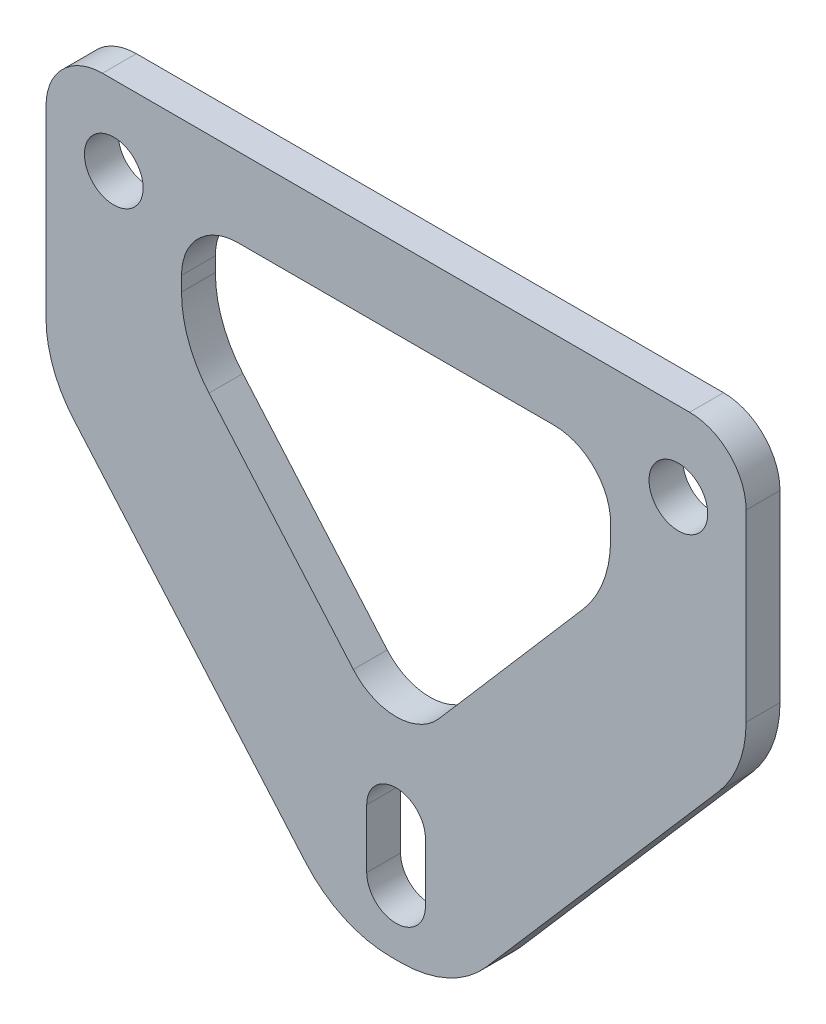
ISO-10303-21;
HEADER;
FILE_DESCRIPTION(('STEP AP214'),'2;1');
FILE_NAME('part.step','',(''),(''),'','','');
FILE_SCHEMA(('AUTOMOTIVE_DESIGN { 1 0 10303 214 1 1 1 1 }'));
ENDSEC;
DATA;
#1=APPLICATION_CONTEXT('core data for automotive mechanical design processes');
#2=APPLICATION_PROTOCOL_DEFINITION('international standard','automotive_design',2000,#1);
#3=PRODUCT_CONTEXT('',#1,'mechanical');
#4=PRODUCT('Part','Part','',(#3));
#5=PRODUCT_RELATED_PRODUCT_CATEGORY('part','',(#4));
#6=PRODUCT_DEFINITION_FORMATION('','',#4);
#7=PRODUCT_DEFINITION_CONTEXT('part definition',#1,'design');
#8=PRODUCT_DEFINITION('design','',#6,#7);
#9=PRODUCT_DEFINITION_SHAPE('','',#8);
#10=(LENGTH_UNIT() NAMED_UNIT(*) SI_UNIT(.MILLI.,.METRE.));
#11=(NAMED_UNIT(*) PLANE_ANGLE_UNIT() SI_UNIT($,.RADIAN.));
#12=(NAMED_UNIT(*) SI_UNIT($,.STERADIAN.) SOLID_ANGLE_UNIT());
#13=UNCERTAINTY_MEASURE_WITH_UNIT(LENGTH_MEASURE(1.E-05),#10,'distance_accuracy_value','');
#14=(GEOMETRIC_REPRESENTATION_CONTEXT(3) GLOBAL_UNCERTAINTY_ASSIGNED_CONTEXT((#13)) GLOBAL_UNIT_ASSIGNED_CONTEXT((#10,
#11,#12)) REPRESENTATION_CONTEXT('',''));
#15=CARTESIAN_POINT('',(0.,0.,0.));
#16=DIRECTION('',(0.,0.,1.));
#17=DIRECTION('',(1.,0.,0.));
#18=AXIS2_PLACEMENT_3D('',#15,#16,#17);
#19=CARTESIAN_POINT('',(-31.,-25.5594059405941,-3.));
#20=DIRECTION('',(-1.,0.,0.));
#21=DIRECTION('',(0.,-1.,0.));
#22=AXIS2_PLACEMENT_3D('',#19,#20,#21);
#23=PLANE('',#22);
#24=DIRECTION('',(0.,-1.,0.));
#25=VECTOR('',#24,1.);
#26=CARTESIAN_POINT('',(-31.,-25.5594059405941,0.));
#27=LINE('',#26,#25);
#28=CARTESIAN_POINT('',(-31.,-5.55940594059406,0.));
#29=VERTEX_POINT('',#28);
#30=CARTESIAN_POINT('',(-31.,-21.8290726780716,0.));
#31=VERTEX_POINT('',#30);
#32=EDGE_CURVE('E289',#29,#31,#27,.T.);
#33=ORIENTED_EDGE('',*,*,#32,.F.);
#34=DIRECTION('',(0.,0.,1.));
#35=VECTOR('',#34,1.);
#36=CARTESIAN_POINT('',(-31.,-5.55940594059406,-3.));
#37=LINE('',#36,#35);
#38=CARTESIAN_POINT('',(-31.,-5.55940594059406,-3.));
#39=VERTEX_POINT('',#38);
#40=EDGE_CURVE('E58',#29,#39,#37,.F.);
#41=ORIENTED_EDGE('',*,*,#40,.T.);
#42=DIRECTION('',(0.,-1.,0.));
#43=VECTOR('',#42,1.);
#44=CARTESIAN_POINT('',(-31.,-25.5594059405941,-3.));
#45=LINE('',#44,#43);
#46=CARTESIAN_POINT('',(-31.,-21.8290726780716,-3.));
#47=VERTEX_POINT('',#46);
#48=EDGE_CURVE('E293',#39,#47,#45,.T.);
#49=ORIENTED_EDGE('',*,*,#48,.T.);
#50=DIRECTION('',(0.,0.,1.));
#51=VECTOR('',#50,1.);
#52=CARTESIAN_POINT('',(-31.,-21.8290726780716,-3.));
#53=LINE('',#52,#51);
#54=EDGE_CURVE('E395',#47,#31,#53,.T.);
#55=ORIENTED_EDGE('',*,*,#54,.T.);
#56=EDGE_LOOP('',(#33,#41,#49,#55));
#57=FACE_BOUND('',#56,.T.);
#58=ADVANCED_FACE('F42',(#57),#23,.T.);
#59=CARTESIAN_POINT('',(-31.,-0.55940594059406,-3.));
#60=DIRECTION('',(0.,1.,0.));
#61=DIRECTION('',(-1.,0.,0.));
#62=AXIS2_PLACEMENT_3D('',#59,#60,#61);
#63=PLANE('',#62);
#64=DIRECTION('',(-1.,0.,0.));
#65=VECTOR('',#64,1.);
#66=CARTESIAN_POINT('',(-31.,-0.55940594059406,0.));
#67=LINE('',#66,#65);
#68=CARTESIAN_POINT('',(26.,-0.559405940594053,0.));
#69=VERTEX_POINT('',#68);
#70=CARTESIAN_POINT('',(-26.,-0.559405940594059,0.));
#71=VERTEX_POINT('',#70);
#72=EDGE_CURVE('E297',#69,#71,#67,.T.);
#73=ORIENTED_EDGE('',*,*,#72,.F.);
#74=DIRECTION('',(0.,0.,1.));
#75=VECTOR('',#74,1.);
#76=CARTESIAN_POINT('',(26.,-0.559405940594053,-3.));
#77=LINE('',#76,#75);
#78=CARTESIAN_POINT('',(26.,-0.559405940594053,-3.));
#79=VERTEX_POINT('',#78);
#80=EDGE_CURVE('E445',#69,#79,#77,.F.);
#81=ORIENTED_EDGE('',*,*,#80,.T.);
#82=DIRECTION('',(-1.,0.,0.));
#83=VECTOR('',#82,1.);
#84=CARTESIAN_POINT('',(-31.,-0.55940594059406,-3.));
#85=LINE('',#84,#83);
#86=CARTESIAN_POINT('',(-26.,-0.559405940594059,-3.));
#87=VERTEX_POINT('',#86);
#88=EDGE_CURVE('E313',#79,#87,#85,.T.);
#89=ORIENTED_EDGE('',*,*,#88,.T.);
#90=DIRECTION('',(0.,0.,1.));
#91=VECTOR('',#90,1.);
#92=CARTESIAN_POINT('',(-26.,-0.559405940594059,-3.));
#93=LINE('',#92,#91);
#94=EDGE_CURVE('E441',#87,#71,#93,.T.);
#95=ORIENTED_EDGE('',*,*,#94,.T.);
#96=EDGE_LOOP('',(#73,#81,#89,#95));
#97=FACE_BOUND('',#96,.T.);
#98=ADVANCED_FACE('F561',(#97),#63,.T.);
#99=CARTESIAN_POINT('',(31.,-0.559405940594052,-3.));
#100=DIRECTION('',(1.,0.,0.));
#101=DIRECTION('',(0.,1.,0.));
#102=AXIS2_PLACEMENT_3D('',#99,#100,#101);
#103=PLANE('',#102);
#104=DIRECTION('',(0.,1.,0.));
#105=VECTOR('',#104,1.);
#106=CARTESIAN_POINT('',(31.,-0.559405940594052,-3.));
#107=LINE('',#106,#105);
#108=CARTESIAN_POINT('',(31.,-21.8290726780716,-3.));
#109=VERTEX_POINT('',#108);
#110=CARTESIAN_POINT('',(31.,-5.55940594059405,-3.));
#111=VERTEX_POINT('',#110);
#112=EDGE_CURVE('E309',#109,#111,#107,.T.);
#113=ORIENTED_EDGE('',*,*,#112,.T.);
#114=DIRECTION('',(0.,0.,1.));
#115=VECTOR('',#114,1.);
#116=CARTESIAN_POINT('',(31.,-5.55940594059405,-3.));
#117=LINE('',#116,#115);
#118=CARTESIAN_POINT('',(31.,-5.55940594059405,0.));
#119=VERTEX_POINT('',#118);
#120=EDGE_CURVE('E431',#111,#119,#117,.T.);
#121=ORIENTED_EDGE('',*,*,#120,.T.);
#122=DIRECTION('',(0.,1.,0.));
#123=VECTOR('',#122,1.);
#124=CARTESIAN_POINT('',(31.,-0.559405940594052,0.));
#125=LINE('',#124,#123);
#126=CARTESIAN_POINT('',(31.,-21.8290726780716,0.));
#127=VERTEX_POINT('',#126);
#128=EDGE_CURVE('E332',#127,#119,#125,.T.);
#129=ORIENTED_EDGE('',*,*,#128,.F.);
#130=DIRECTION('',(0.,0.,1.));
#131=VECTOR('',#130,1.);
#132=CARTESIAN_POINT('',(31.,-21.8290726780716,-3.));
#133=LINE('',#132,#131);
#134=EDGE_CURVE('E365',#127,#109,#133,.F.);
#135=ORIENTED_EDGE('',*,*,#134,.T.);
#136=EDGE_LOOP('',(#113,#121,#129,#135));
#137=FACE_BOUND('',#136,.T.);
#138=ADVANCED_FACE('F566',(#137),#103,.T.);
#139=CARTESIAN_POINT('',(31.,-25.5594059405941,-3.));
#140=DIRECTION('',(0.755689082789818,-0.654930538417842,0.));
#141=DIRECTION('',(0.654930538417842,0.755689082789818,0.));
#142=AXIS2_PLACEMENT_3D('',#139,#140,#141);
#143=PLANE('',#142);
#144=DIRECTION('',(0.654930538417842,0.755689082789818,0.));
#145=VECTOR('',#144,1.);
#146=CARTESIAN_POINT('',(31.,-25.5594059405941,-3.));
#147=LINE('',#146,#145);
#148=CARTESIAN_POINT('',(7.99060200037871,-52.1087113247725,-3.));
#149=VERTEX_POINT('',#148);
#150=CARTESIAN_POINT('',(28.5568908278982,-28.37837806225,-3.));
#151=VERTEX_POINT('',#150);
#152=EDGE_CURVE('E305',#149,#151,#147,.T.);
#153=ORIENTED_EDGE('',*,*,#152,.T.);
#154=DIRECTION('',(0.,0.,1.));
#155=VECTOR('',#154,1.);
#156=CARTESIAN_POINT('',(28.5568908278982,-28.37837806225,-3.));
#157=LINE('',#156,#155);
#158=CARTESIAN_POINT('',(28.5568908278982,-28.37837806225,0.));
#159=VERTEX_POINT('',#158);
#160=EDGE_CURVE('E349',#151,#159,#157,.T.);
#161=ORIENTED_EDGE('',*,*,#160,.T.);
#162=DIRECTION('',(0.654930538417842,0.755689082789818,0.));
#163=VECTOR('',#162,1.);
#164=CARTESIAN_POINT('',(31.,-25.5594059405941,0.));
#165=LINE('',#164,#163);
#166=CARTESIAN_POINT('',(7.99060200037871,-52.1087113247725,0.));
#167=VERTEX_POINT('',#166);
#168=EDGE_CURVE('E328',#167,#159,#165,.T.);
#169=ORIENTED_EDGE('',*,*,#168,.F.);
#170=DIRECTION('',(0.,0.,1.));
#171=VECTOR('',#170,1.);
#172=CARTESIAN_POINT('',(7.99060200037872,-52.1087113247725,-3.));
#173=LINE('',#172,#171);
#174=EDGE_CURVE('E346',#167,#149,#173,.F.);
#175=ORIENTED_EDGE('',*,*,#174,.T.);
#176=EDGE_LOOP('',(#153,#161,#169,#175));
#177=FACE_BOUND('',#176,.T.);
#178=ADVANCED_FACE('F625',(#177),#143,.T.);
#179=CARTESIAN_POINT('',(5.00000000000001,-55.5594059405941,-3.));
#180=DIRECTION('',(0.,-1.,0.));
#181=DIRECTION('',(0.,0.,-1.));
#182=AXIS2_PLACEMENT_3D('',#179,#180,#181);
#183=PLANE('',#182);
#184=DIRECTION('',(1.,0.,0.));
#185=VECTOR('',#184,1.);
#186=CARTESIAN_POINT('',(5.00000000000001,-55.5594059405941,-3.));
#187=LINE('',#186,#185);
#188=CARTESIAN_POINT('',(-0.433711172480529,-55.5594059405941,-3.));
#189=VERTEX_POINT('',#188);
#190=CARTESIAN_POINT('',(0.433711172480544,-55.5594059405941,-3.));
#191=VERTEX_POINT('',#190);
#192=EDGE_CURVE('E301',#189,#191,#187,.T.);
#193=ORIENTED_EDGE('',*,*,#192,.T.);
#194=DIRECTION('',(0.,0.,1.));
#195=VECTOR('',#194,1.);
#196=CARTESIAN_POINT('',(0.433711172480544,-55.5594059405941,-3.));
#197=LINE('',#196,#195);
#198=CARTESIAN_POINT('',(0.433711172480544,-55.5594059405941,0.));
#199=VERTEX_POINT('',#198);
#200=EDGE_CURVE('E384',#191,#199,#197,.T.);
#201=ORIENTED_EDGE('',*,*,#200,.T.);
#202=DIRECTION('',(1.,0.,0.));
#203=VECTOR('',#202,1.);
#204=CARTESIAN_POINT('',(5.00000000000001,-55.5594059405941,0.));
#205=LINE('',#204,#203);
#206=CARTESIAN_POINT('',(-0.433711172480529,-55.5594059405941,0.));
#207=VERTEX_POINT('',#206);
#208=EDGE_CURVE('E324',#207,#199,#205,.T.);
#209=ORIENTED_EDGE('',*,*,#208,.F.);
#210=DIRECTION('',(0.,0.,1.));
#211=VECTOR('',#210,1.);
#212=CARTESIAN_POINT('',(-0.433711172480529,-55.5594059405941,-3.));
#213=LINE('',#212,#211);
#214=EDGE_CURVE('E381',#207,#189,#213,.F.);
#215=ORIENTED_EDGE('',*,*,#214,.T.);
#216=EDGE_LOOP('',(#193,#201,#209,#215));
#217=FACE_BOUND('',#216,.T.);
#218=ADVANCED_FACE('F632',(#217),#183,.T.);
#219=CARTESIAN_POINT('',(-4.99999999999999,-55.5594059405941,-3.));
#220=DIRECTION('',(-0.755689082789817,-0.654930538417842,0.));
#221=DIRECTION('',(0.654930538417842,-0.755689082789818,0.));
#222=AXIS2_PLACEMENT_3D('',#219,#220,#221);
#223=PLANE('',#222);
#224=DIRECTION('',(0.654930538417842,-0.755689082789818,0.));
#225=VECTOR('',#224,1.);
#226=CARTESIAN_POINT('',(-4.99999999999999,-55.5594059405941,-3.));
#227=LINE('',#226,#225);
#228=CARTESIAN_POINT('',(-28.5568908278982,-28.37837806225,-3.));
#229=VERTEX_POINT('',#228);
#230=CARTESIAN_POINT('',(-7.9906020003787,-52.1087113247725,-3.));
#231=VERTEX_POINT('',#230);
#232=EDGE_CURVE('E296',#229,#231,#227,.T.);
#233=ORIENTED_EDGE('',*,*,#232,.T.);
#234=DIRECTION('',(0.,0.,1.));
#235=VECTOR('',#234,1.);
#236=CARTESIAN_POINT('',(-7.9906020003787,-52.1087113247725,-3.));
#237=LINE('',#236,#235);
#238=CARTESIAN_POINT('',(-7.9906020003787,-52.1087113247725,0.));
#239=VERTEX_POINT('',#238);
#240=EDGE_CURVE('E391',#231,#239,#237,.T.);
#241=ORIENTED_EDGE('',*,*,#240,.T.);
#242=DIRECTION('',(0.654930538417842,-0.755689082789818,0.));
#243=VECTOR('',#242,1.);
#244=CARTESIAN_POINT('',(-4.99999999999999,-55.5594059405941,0.));
#245=LINE('',#244,#243);
#246=CARTESIAN_POINT('',(-28.5568908278982,-28.37837806225,0.));
#247=VERTEX_POINT('',#246);
#248=EDGE_CURVE('E320',#247,#239,#245,.T.);
#249=ORIENTED_EDGE('',*,*,#248,.F.);
#250=DIRECTION('',(0.,0.,1.));
#251=VECTOR('',#250,1.);
#252=CARTESIAN_POINT('',(-28.5568908278982,-28.37837806225,-3.));
#253=LINE('',#252,#251);
#254=EDGE_CURVE('E388',#247,#229,#253,.F.);
#255=ORIENTED_EDGE('',*,*,#254,.T.);
#256=EDGE_LOOP('',(#233,#241,#249,#255));
#257=FACE_BOUND('',#256,.T.);
#258=ADVANCED_FACE('F571',(#257),#223,.T.);
#259=CARTESIAN_POINT('',(0.,0.,-3.));
#260=DIRECTION('',(0.,0.,-1.));
#261=DIRECTION('',(-1.,0.,0.));
#262=AXIS2_PLACEMENT_3D('',#259,#260,#261);
#263=PLANE('',#262);
#264=DIRECTION('',(-1.,0.,0.));
#265=VECTOR('',#264,1.);
#266=CARTESIAN_POINT('',(19.,-7.55940594059405,-3.));
#267=LINE('',#266,#265);
#268=CARTESIAN_POINT('',(14.,-7.55940594059405,-3.));
#269=VERTEX_POINT('',#268);
#270=CARTESIAN_POINT('',(-14.,-7.55940594059406,-3.));
#271=VERTEX_POINT('',#270);
#272=EDGE_CURVE('E507',#269,#271,#267,.T.);
#273=ORIENTED_EDGE('',*,*,#272,.T.);
#274=CARTESIAN_POINT('',(-14.,-12.5594059405941,-3.));
#275=DIRECTION('',(0.,0.,-1.));
#276=DIRECTION('',(-1.,0.,0.));
#277=AXIS2_PLACEMENT_3D('',#274,#275,#276);
#278=CIRCLE('',#277,5.);
#279=CARTESIAN_POINT('',(-19.,-12.5594059405941,-3.));
#280=VERTEX_POINT('',#279);
#281=EDGE_CURVE('E476',#271,#280,#278,.F.);
#282=ORIENTED_EDGE('',*,*,#281,.T.);
#283=DIRECTION('',(0.,-1.,0.));
#284=VECTOR('',#283,1.);
#285=CARTESIAN_POINT('',(-19.,-7.55940594059406,-3.));
#286=LINE('',#285,#284);
#287=CARTESIAN_POINT('',(-19.,-13.838940831385,-3.));
#288=VERTEX_POINT('',#287);
#289=EDGE_CURVE('E262',#280,#288,#286,.T.);
#290=ORIENTED_EDGE('',*,*,#289,.T.);
#291=CARTESIAN_POINT('',(-9.,-13.838940831385,-3.));
#292=DIRECTION('',(0.,0.,-1.));
#293=DIRECTION('',(-1.,0.,0.));
#294=AXIS2_PLACEMENT_3D('',#291,#292,#293);
#295=CIRCLE('',#294,10.);
#296=CARTESIAN_POINT('',(-16.5682300776916,-20.3751395348459,-3.));
#297=VERTEX_POINT('',#296);
#298=EDGE_CURVE('E418',#288,#297,#295,.F.);
#299=ORIENTED_EDGE('',*,*,#298,.T.);
#300=DIRECTION('',(0.653619870346093,-0.75682300776916,0.));
#301=VECTOR('',#300,1.);
#302=CARTESIAN_POINT('',(-19.,-17.5594059405941,-3.));
#303=LINE('',#302,#301);
#304=CARTESIAN_POINT('',(-3.78411503884579,-35.1777990535094,-3.));
#305=VERTEX_POINT('',#304);
#306=EDGE_CURVE('E503',#297,#305,#303,.T.);
#307=ORIENTED_EDGE('',*,*,#306,.T.);
#308=CARTESIAN_POINT('',(0.,-31.909699701779,-3.));
#309=DIRECTION('',(0.,0.,-1.));
#310=DIRECTION('',(-1.,0.,0.));
#311=AXIS2_PLACEMENT_3D('',#308,#309,#310);
#312=CIRCLE('',#311,5.);
#313=CARTESIAN_POINT('',(3.78411503884581,-35.1777990535094,-3.));
#314=VERTEX_POINT('',#313);
#315=EDGE_CURVE('E11',#305,#314,#312,.F.);
#316=ORIENTED_EDGE('',*,*,#315,.T.);
#317=DIRECTION('',(0.653619870346092,0.75682300776916,0.));
#318=VECTOR('',#317,1.);
#319=CARTESIAN_POINT('',(0.,-39.5594059405941,-3.));
#320=LINE('',#319,#318);
#321=CARTESIAN_POINT('',(16.5682300776916,-20.3751395348459,-3.));
#322=VERTEX_POINT('',#321);
#323=EDGE_CURVE('E498',#314,#322,#320,.T.);
#324=ORIENTED_EDGE('',*,*,#323,.T.);
#325=CARTESIAN_POINT('',(9.,-13.838940831385,-3.));
#326=DIRECTION('',(0.,0.,-1.));
#327=DIRECTION('',(-1.,0.,0.));
#328=AXIS2_PLACEMENT_3D('',#325,#326,#327);
#329=CIRCLE('',#328,10.);
#330=CARTESIAN_POINT('',(19.,-13.838940831385,-3.));
#331=VERTEX_POINT('',#330);
#332=EDGE_CURVE('E411',#322,#331,#329,.F.);
#333=ORIENTED_EDGE('',*,*,#332,.T.);
#334=DIRECTION('',(0.,1.,0.));
#335=VECTOR('',#334,1.);
#336=CARTESIAN_POINT('',(19.,-17.5594059405941,-3.));
#337=LINE('',#336,#335);
#338=CARTESIAN_POINT('',(19.,-12.5594059405941,-3.));
#339=VERTEX_POINT('',#338);
#340=EDGE_CURVE('E502',#331,#339,#337,.T.);
#341=ORIENTED_EDGE('',*,*,#340,.T.);
#342=CARTESIAN_POINT('',(14.,-12.5594059405941,-3.));
#343=DIRECTION('',(0.,0.,-1.));
#344=DIRECTION('',(-1.,0.,0.));
#345=AXIS2_PLACEMENT_3D('',#342,#343,#344);
#346=CIRCLE('',#345,5.);
#347=EDGE_CURVE('E470',#339,#269,#346,.F.);
#348=ORIENTED_EDGE('',*,*,#347,.T.);
#349=EDGE_LOOP('',(#273,#282,#290,#299,#307,#316,#324,#333,#341,#348));
#350=FACE_BOUND('',#349,.T.);
#351=CARTESIAN_POINT('',(0.,-50.1594059405941,-3.));
#352=DIRECTION('',(0.,0.,1.));
#353=DIRECTION('',(1.,0.,0.));
#354=AXIS2_PLACEMENT_3D('',#351,#352,#353);
#355=CIRCLE('',#354,2.6);
#356=CARTESIAN_POINT('',(-2.59999999999999,-50.1594059405941,-3.));
#357=VERTEX_POINT('',#356);
#358=CARTESIAN_POINT('',(2.60000000000001,-50.1594059405941,-3.));
#359=VERTEX_POINT('',#358);
#360=EDGE_CURVE('E220',#357,#359,#355,.T.);
#361=ORIENTED_EDGE('',*,*,#360,.T.);
#362=DIRECTION('',(0.,1.,0.));
#363=VECTOR('',#362,1.);
#364=CARTESIAN_POINT('',(2.60000000000001,-50.1594059405941,-3.));
#365=LINE('',#364,#363);
#366=CARTESIAN_POINT('',(2.6,-44.9594059405941,-3.));
#367=VERTEX_POINT('',#366);
#368=EDGE_CURVE('E233',#359,#367,#365,.T.);
#369=ORIENTED_EDGE('',*,*,#368,.T.);
#370=CARTESIAN_POINT('',(0.,-44.9594059405941,-3.));
#371=DIRECTION('',(0.,0.,1.));
#372=DIRECTION('',(1.,0.,0.));
#373=AXIS2_PLACEMENT_3D('',#370,#371,#372);
#374=CIRCLE('',#373,2.6);
#375=CARTESIAN_POINT('',(-2.59999999999999,-44.9594059405941,-3.));
#376=VERTEX_POINT('',#375);
#377=EDGE_CURVE('E238',#367,#376,#374,.T.);
#378=ORIENTED_EDGE('',*,*,#377,.T.);
#379=DIRECTION('',(0.,-1.,0.));
#380=VECTOR('',#379,1.);
#381=CARTESIAN_POINT('',(-2.59999999999999,-50.1594059405941,-3.));
#382=LINE('',#381,#380);
#383=EDGE_CURVE('E229',#376,#357,#382,.T.);
#384=ORIENTED_EDGE('',*,*,#383,.T.);
#385=EDGE_LOOP('',(#361,#369,#378,#384));
#386=FACE_BOUND('',#385,.T.);
#387=CARTESIAN_POINT('',(25.,-7.55940594059405,-3.));
#388=DIRECTION('',(0.,0.,1.));
#389=DIRECTION('',(1.,0.,0.));
#390=AXIS2_PLACEMENT_3D('',#387,#388,#389);
#391=CIRCLE('',#390,2.6);
#392=CARTESIAN_POINT('',(27.6,-7.55940594059405,-3.));
#393=VERTEX_POINT('',#392);
#394=EDGE_CURVE('E277',#393,#393,#391,.T.);
#395=ORIENTED_EDGE('',*,*,#394,.T.);
#396=EDGE_LOOP('',(#395));
#397=FACE_BOUND('',#396,.T.);
#398=CARTESIAN_POINT('',(-25.,-7.55940594059406,-3.));
#399=DIRECTION('',(0.,0.,1.));
#400=DIRECTION('',(1.,0.,0.));
#401=AXIS2_PLACEMENT_3D('',#398,#399,#400);
#402=CIRCLE('',#401,2.6);
#403=CARTESIAN_POINT('',(-22.4,-7.55940594059406,-3.));
#404=VERTEX_POINT('',#403);
#405=EDGE_CURVE('E285',#404,#404,#402,.T.);
#406=ORIENTED_EDGE('',*,*,#405,.T.);
#407=EDGE_LOOP('',(#406));
#408=FACE_BOUND('',#407,.T.);
#409=ORIENTED_EDGE('',*,*,#88,.F.);
#410=CARTESIAN_POINT('',(26.,-5.55940594059405,-3.));
#411=DIRECTION('',(0.,0.,-1.));
#412=DIRECTION('',(-1.,0.,0.));
#413=AXIS2_PLACEMENT_3D('',#410,#411,#412);
#414=CIRCLE('',#413,5.);
#415=EDGE_CURVE('E451',#79,#111,#414,.T.);
#416=ORIENTED_EDGE('',*,*,#415,.T.);
#417=ORIENTED_EDGE('',*,*,#112,.F.);
#418=CARTESIAN_POINT('',(21.,-21.8290726780716,-3.));
#419=DIRECTION('',(0.,0.,-1.));
#420=DIRECTION('',(-1.,0.,0.));
#421=AXIS2_PLACEMENT_3D('',#418,#419,#420);
#422=CIRCLE('',#421,10.);
#423=EDGE_CURVE('E378',#109,#151,#422,.T.);
#424=ORIENTED_EDGE('',*,*,#423,.T.);
#425=ORIENTED_EDGE('',*,*,#152,.F.);
#426=CARTESIAN_POINT('',(0.433711172480544,-45.5594059405941,-3.));
#427=DIRECTION('',(0.,0.,-1.));
#428=DIRECTION('',(-1.,0.,0.));
#429=AXIS2_PLACEMENT_3D('',#426,#427,#428);
#430=CIRCLE('',#429,10.);
#431=EDGE_CURVE('E375',#149,#191,#430,.T.);
#432=ORIENTED_EDGE('',*,*,#431,.T.);
#433=ORIENTED_EDGE('',*,*,#192,.F.);
#434=CARTESIAN_POINT('',(-0.433711172480529,-45.5594059405941,-3.));
#435=DIRECTION('',(0.,0.,-1.));
#436=DIRECTION('',(-1.,0.,0.));
#437=AXIS2_PLACEMENT_3D('',#434,#435,#436);
#438=CIRCLE('',#437,10.);
#439=EDGE_CURVE('E372',#189,#231,#438,.T.);
#440=ORIENTED_EDGE('',*,*,#439,.T.);
#441=ORIENTED_EDGE('',*,*,#232,.F.);
#442=CARTESIAN_POINT('',(-21.,-21.8290726780716,-3.));
#443=DIRECTION('',(0.,0.,-1.));
#444=DIRECTION('',(-1.,0.,0.));
#445=AXIS2_PLACEMENT_3D('',#442,#443,#444);
#446=CIRCLE('',#445,10.);
#447=EDGE_CURVE('E368',#229,#47,#446,.T.);
#448=ORIENTED_EDGE('',*,*,#447,.T.);
#449=ORIENTED_EDGE('',*,*,#48,.F.);
#450=CARTESIAN_POINT('',(-26.,-5.55940594059406,-3.));
#451=DIRECTION('',(0.,0.,-1.));
#452=DIRECTION('',(-1.,0.,0.));
#453=AXIS2_PLACEMENT_3D('',#450,#451,#452);
#454=CIRCLE('',#453,5.);
#455=EDGE_CURVE('E448',#39,#87,#454,.T.);
#456=ORIENTED_EDGE('',*,*,#455,.T.);
#457=EDGE_LOOP('',(#409,#416,#417,#424,#425,#432,#433,#440,#441,#448,#449,#456));
#458=FACE_BOUND('',#457,.T.);
#459=ADVANCED_FACE('F240',(#350,#386,#397,#408,#458),#263,.T.);
#460=CARTESIAN_POINT('',(0.,0.,0.));
#461=DIRECTION('',(0.,0.,-1.));
#462=DIRECTION('',(-1.,0.,0.));
#463=AXIS2_PLACEMENT_3D('',#460,#461,#462);
#464=PLANE('',#463);
#465=DIRECTION('',(0.653619870346092,0.75682300776916,0.));
#466=VECTOR('',#465,1.);
#467=CARTESIAN_POINT('',(0.,-39.5594059405941,0.));
#468=LINE('',#467,#466);
#469=CARTESIAN_POINT('',(3.78411503884581,-35.1777990535094,0.));
#470=VERTEX_POINT('',#469);
#471=CARTESIAN_POINT('',(16.5682300776916,-20.3751395348459,0.));
#472=VERTEX_POINT('',#471);
#473=EDGE_CURVE('E486',#470,#472,#468,.T.);
#474=ORIENTED_EDGE('',*,*,#473,.F.);
#475=CARTESIAN_POINT('',(0.,-31.909699701779,0.));
#476=DIRECTION('',(0.,0.,-1.));
#477=DIRECTION('',(-1.,0.,0.));
#478=AXIS2_PLACEMENT_3D('',#475,#476,#477);
#479=CIRCLE('',#478,5.);
#480=CARTESIAN_POINT('',(-3.78411503884579,-35.1777990535094,0.));
#481=VERTEX_POINT('',#480);
#482=EDGE_CURVE('E51',#470,#481,#479,.T.);
#483=ORIENTED_EDGE('',*,*,#482,.T.);
#484=DIRECTION('',(0.653619870346093,-0.75682300776916,0.));
#485=VECTOR('',#484,1.);
#486=CARTESIAN_POINT('',(-19.,-17.5594059405941,0.));
#487=LINE('',#486,#485);
#488=CARTESIAN_POINT('',(-16.5682300776916,-20.3751395348459,0.));
#489=VERTEX_POINT('',#488);
#490=EDGE_CURVE('E485',#489,#481,#487,.T.);
#491=ORIENTED_EDGE('',*,*,#490,.F.);
#492=CARTESIAN_POINT('',(-9.,-13.838940831385,0.));
#493=DIRECTION('',(0.,0.,-1.));
#494=DIRECTION('',(-1.,0.,0.));
#495=AXIS2_PLACEMENT_3D('',#492,#493,#494);
#496=CIRCLE('',#495,10.);
#497=CARTESIAN_POINT('',(-19.,-13.838940831385,0.));
#498=VERTEX_POINT('',#497);
#499=EDGE_CURVE('E414',#489,#498,#496,.T.);
#500=ORIENTED_EDGE('',*,*,#499,.T.);
#501=DIRECTION('',(0.,-1.,0.));
#502=VECTOR('',#501,1.);
#503=CARTESIAN_POINT('',(-19.,-7.55940594059406,0.));
#504=LINE('',#503,#502);
#505=CARTESIAN_POINT('',(-19.,-12.5594059405941,0.));
#506=VERTEX_POINT('',#505);
#507=EDGE_CURVE('E253',#506,#498,#504,.T.);
#508=ORIENTED_EDGE('',*,*,#507,.F.);
#509=CARTESIAN_POINT('',(-14.,-12.5594059405941,0.));
#510=DIRECTION('',(0.,0.,-1.));
#511=DIRECTION('',(-1.,0.,0.));
#512=AXIS2_PLACEMENT_3D('',#509,#510,#511);
#513=CIRCLE('',#512,5.);
#514=CARTESIAN_POINT('',(-14.,-7.55940594059406,0.));
#515=VERTEX_POINT('',#514);
#516=EDGE_CURVE('E473',#506,#515,#513,.T.);
#517=ORIENTED_EDGE('',*,*,#516,.T.);
#518=DIRECTION('',(-1.,0.,0.));
#519=VECTOR('',#518,1.);
#520=CARTESIAN_POINT('',(19.,-7.55940594059405,0.));
#521=LINE('',#520,#519);
#522=CARTESIAN_POINT('',(14.,-7.55940594059405,0.));
#523=VERTEX_POINT('',#522);
#524=EDGE_CURVE('E521',#523,#515,#521,.T.);
#525=ORIENTED_EDGE('',*,*,#524,.F.);
#526=CARTESIAN_POINT('',(14.,-12.5594059405941,0.));
#527=DIRECTION('',(0.,0.,-1.));
#528=DIRECTION('',(-1.,0.,0.));
#529=AXIS2_PLACEMENT_3D('',#526,#527,#528);
#530=CIRCLE('',#529,5.);
#531=CARTESIAN_POINT('',(19.,-12.5594059405941,0.));
#532=VERTEX_POINT('',#531);
#533=EDGE_CURVE('E467',#523,#532,#530,.T.);
#534=ORIENTED_EDGE('',*,*,#533,.T.);
#535=DIRECTION('',(0.,1.,0.));
#536=VECTOR('',#535,1.);
#537=CARTESIAN_POINT('',(19.,-17.5594059405941,0.));
#538=LINE('',#537,#536);
#539=CARTESIAN_POINT('',(19.,-13.838940831385,0.));
#540=VERTEX_POINT('',#539);
#541=EDGE_CURVE('E518',#540,#532,#538,.T.);
#542=ORIENTED_EDGE('',*,*,#541,.F.);
#543=CARTESIAN_POINT('',(9.,-13.838940831385,0.));
#544=DIRECTION('',(0.,0.,-1.));
#545=DIRECTION('',(-1.,0.,0.));
#546=AXIS2_PLACEMENT_3D('',#543,#544,#545);
#547=CIRCLE('',#546,10.);
#548=EDGE_CURVE('E407',#540,#472,#547,.T.);
#549=ORIENTED_EDGE('',*,*,#548,.T.);
#550=EDGE_LOOP('',(#474,#483,#491,#500,#508,#517,#525,#534,#542,#549));
#551=FACE_BOUND('',#550,.T.);
#552=DIRECTION('',(0.,1.,0.));
#553=VECTOR('',#552,1.);
#554=CARTESIAN_POINT('',(2.60000000000001,-50.1594059405941,0.));
#555=LINE('',#554,#553);
#556=CARTESIAN_POINT('',(2.60000000000001,-50.1594059405941,0.));
#557=VERTEX_POINT('',#556);
#558=CARTESIAN_POINT('',(2.6,-44.9594059405941,0.));
#559=VERTEX_POINT('',#558);
#560=EDGE_CURVE('E261',#557,#559,#555,.T.);
#561=ORIENTED_EDGE('',*,*,#560,.F.);
#562=CARTESIAN_POINT('',(0.,-50.1594059405941,0.));
#563=DIRECTION('',(0.,0.,1.));
#564=DIRECTION('',(1.,0.,0.));
#565=AXIS2_PLACEMENT_3D('',#562,#563,#564);
#566=CIRCLE('',#565,2.6);
#567=CARTESIAN_POINT('',(-2.59999999999999,-50.1594059405941,0.));
#568=VERTEX_POINT('',#567);
#569=EDGE_CURVE('E223',#568,#557,#566,.T.);
#570=ORIENTED_EDGE('',*,*,#569,.F.);
#571=DIRECTION('',(0.,-1.,0.));
#572=VECTOR('',#571,1.);
#573=CARTESIAN_POINT('',(-2.59999999999999,-50.1594059405941,0.));
#574=LINE('',#573,#572);
#575=CARTESIAN_POINT('',(-2.59999999999999,-44.9594059405941,0.));
#576=VERTEX_POINT('',#575);
#577=EDGE_CURVE('E244',#576,#568,#574,.T.);
#578=ORIENTED_EDGE('',*,*,#577,.F.);
#579=CARTESIAN_POINT('',(0.,-44.9594059405941,0.));
#580=DIRECTION('',(0.,0.,1.));
#581=DIRECTION('',(1.,0.,0.));
#582=AXIS2_PLACEMENT_3D('',#579,#580,#581);
#583=CIRCLE('',#582,2.6);
#584=EDGE_CURVE('E250',#559,#576,#583,.T.);
#585=ORIENTED_EDGE('',*,*,#584,.F.);
#586=EDGE_LOOP('',(#561,#570,#578,#585));
#587=FACE_BOUND('',#586,.T.);
#588=CARTESIAN_POINT('',(25.,-7.55940594059405,0.));
#589=DIRECTION('',(0.,0.,1.));
#590=DIRECTION('',(1.,0.,0.));
#591=AXIS2_PLACEMENT_3D('',#588,#589,#590);
#592=CIRCLE('',#591,2.6);
#593=CARTESIAN_POINT('',(27.6,-7.55940594059405,0.));
#594=VERTEX_POINT('',#593);
#595=EDGE_CURVE('E271',#594,#594,#592,.T.);
#596=ORIENTED_EDGE('',*,*,#595,.F.);
#597=EDGE_LOOP('',(#596));
#598=FACE_BOUND('',#597,.T.);
#599=CARTESIAN_POINT('',(-25.,-7.55940594059406,0.));
#600=DIRECTION('',(0.,0.,1.));
#601=DIRECTION('',(1.,0.,0.));
#602=AXIS2_PLACEMENT_3D('',#599,#600,#601);
#603=CIRCLE('',#602,2.6);
#604=CARTESIAN_POINT('',(-22.4,-7.55940594059406,0.));
#605=VERTEX_POINT('',#604);
#606=EDGE_CURVE('E281',#605,#605,#603,.T.);
#607=ORIENTED_EDGE('',*,*,#606,.F.);
#608=EDGE_LOOP('',(#607));
#609=FACE_BOUND('',#608,.T.);
#610=ORIENTED_EDGE('',*,*,#128,.T.);
#611=CARTESIAN_POINT('',(26.,-5.55940594059405,0.));
#612=DIRECTION('',(0.,0.,-1.));
#613=DIRECTION('',(-1.,0.,0.));
#614=AXIS2_PLACEMENT_3D('',#611,#612,#613);
#615=CIRCLE('',#614,5.);
#616=EDGE_CURVE('E438',#119,#69,#615,.F.);
#617=ORIENTED_EDGE('',*,*,#616,.T.);
#618=ORIENTED_EDGE('',*,*,#72,.T.);
#619=CARTESIAN_POINT('',(-26.,-5.55940594059406,0.));
#620=DIRECTION('',(0.,0.,-1.));
#621=DIRECTION('',(-1.,0.,0.));
#622=AXIS2_PLACEMENT_3D('',#619,#620,#621);
#623=CIRCLE('',#622,5.);
#624=EDGE_CURVE('E435',#71,#29,#623,.F.);
#625=ORIENTED_EDGE('',*,*,#624,.T.);
#626=ORIENTED_EDGE('',*,*,#32,.T.);
#627=CARTESIAN_POINT('',(-21.,-21.8290726780716,0.));
#628=DIRECTION('',(0.,0.,-1.));
#629=DIRECTION('',(-1.,0.,0.));
#630=AXIS2_PLACEMENT_3D('',#627,#628,#629);
#631=CIRCLE('',#630,10.);
#632=EDGE_CURVE('E353',#31,#247,#631,.F.);
#633=ORIENTED_EDGE('',*,*,#632,.T.);
#634=ORIENTED_EDGE('',*,*,#248,.T.);
#635=CARTESIAN_POINT('',(-0.433711172480529,-45.5594059405941,0.));
#636=DIRECTION('',(0.,0.,-1.));
#637=DIRECTION('',(-1.,0.,0.));
#638=AXIS2_PLACEMENT_3D('',#635,#636,#637);
#639=CIRCLE('',#638,10.);
#640=EDGE_CURVE('E356',#239,#207,#639,.F.);
#641=ORIENTED_EDGE('',*,*,#640,.T.);
#642=ORIENTED_EDGE('',*,*,#208,.T.);
#643=CARTESIAN_POINT('',(0.433711172480544,-45.5594059405941,0.));
#644=DIRECTION('',(0.,0.,-1.));
#645=DIRECTION('',(-1.,0.,0.));
#646=AXIS2_PLACEMENT_3D('',#643,#644,#645);
#647=CIRCLE('',#646,10.);
#648=EDGE_CURVE('E359',#199,#167,#647,.F.);
#649=ORIENTED_EDGE('',*,*,#648,.T.);
#650=ORIENTED_EDGE('',*,*,#168,.T.);
#651=CARTESIAN_POINT('',(21.,-21.8290726780716,0.));
#652=DIRECTION('',(0.,0.,-1.));
#653=DIRECTION('',(-1.,0.,0.));
#654=AXIS2_PLACEMENT_3D('',#651,#652,#653);
#655=CIRCLE('',#654,10.);
#656=EDGE_CURVE('E362',#159,#127,#655,.F.);
#657=ORIENTED_EDGE('',*,*,#656,.T.);
#658=EDGE_LOOP('',(#610,#617,#618,#625,#626,#633,#634,#641,#642,#649,#650,#657));
#659=FACE_BOUND('',#658,.T.);
#660=ADVANCED_FACE('F483',(#551,#587,#598,#609,#659),#464,.F.);
#661=CARTESIAN_POINT('',(-25.,-7.55940594059406,-3.));
#662=DIRECTION('',(0.,0.,1.));
#663=DIRECTION('',(1.,0.,0.));
#664=AXIS2_PLACEMENT_3D('',#661,#662,#663);
#665=CYLINDRICAL_SURFACE('',#664,2.6);
#666=ORIENTED_EDGE('',*,*,#405,.F.);
#667=EDGE_LOOP('',(#666));
#668=FACE_BOUND('',#667,.T.);
#669=ORIENTED_EDGE('',*,*,#606,.T.);
#670=EDGE_LOOP('',(#669));
#671=FACE_BOUND('',#670,.T.);
#672=ADVANCED_FACE('F645',(#668,#671),#665,.F.);
#673=CARTESIAN_POINT('',(25.,-7.55940594059405,-3.));
#674=DIRECTION('',(0.,0.,1.));
#675=DIRECTION('',(1.,0.,0.));
#676=AXIS2_PLACEMENT_3D('',#673,#674,#675);
#677=CYLINDRICAL_SURFACE('',#676,2.6);
#678=ORIENTED_EDGE('',*,*,#394,.F.);
#679=EDGE_LOOP('',(#678));
#680=FACE_BOUND('',#679,.T.);
#681=ORIENTED_EDGE('',*,*,#595,.T.);
#682=EDGE_LOOP('',(#681));
#683=FACE_BOUND('',#682,.T.);
#684=ADVANCED_FACE('F651',(#680,#683),#677,.F.);
#685=CARTESIAN_POINT('',(0.,-50.1594059405941,-3.));
#686=DIRECTION('',(0.,0.,1.));
#687=DIRECTION('',(1.,0.,0.));
#688=AXIS2_PLACEMENT_3D('',#685,#686,#687);
#689=CYLINDRICAL_SURFACE('',#688,2.6);
#690=ORIENTED_EDGE('',*,*,#569,.T.);
#691=DIRECTION('',(0.,0.,1.));
#692=VECTOR('',#691,1.);
#693=CARTESIAN_POINT('',(2.60000000000001,-50.1594059405941,-3.));
#694=LINE('',#693,#692);
#695=EDGE_CURVE('E216',#359,#557,#694,.T.);
#696=ORIENTED_EDGE('',*,*,#695,.F.);
#697=ORIENTED_EDGE('',*,*,#360,.F.);
#698=DIRECTION('',(0.,0.,1.));
#699=VECTOR('',#698,1.);
#700=CARTESIAN_POINT('',(-2.59999999999999,-50.1594059405941,-3.));
#701=LINE('',#700,#699);
#702=EDGE_CURVE('E268',#357,#568,#701,.T.);
#703=ORIENTED_EDGE('',*,*,#702,.T.);
#704=EDGE_LOOP('',(#690,#696,#697,#703));
#705=FACE_BOUND('',#704,.T.);
#706=ADVANCED_FACE('F218',(#705),#689,.F.);
#707=CARTESIAN_POINT('',(-2.59999999999999,-50.1594059405941,-3.));
#708=DIRECTION('',(-1.,0.,0.));
#709=DIRECTION('',(0.,-1.,0.));
#710=AXIS2_PLACEMENT_3D('',#707,#708,#709);
#711=PLANE('',#710);
#712=ORIENTED_EDGE('',*,*,#577,.T.);
#713=ORIENTED_EDGE('',*,*,#702,.F.);
#714=ORIENTED_EDGE('',*,*,#383,.F.);
#715=DIRECTION('',(0.,0.,1.));
#716=VECTOR('',#715,1.);
#717=CARTESIAN_POINT('',(-2.59999999999999,-44.9594059405941,-3.));
#718=LINE('',#717,#716);
#719=EDGE_CURVE('E272',#376,#576,#718,.T.);
#720=ORIENTED_EDGE('',*,*,#719,.T.);
#721=EDGE_LOOP('',(#712,#713,#714,#720));
#722=FACE_BOUND('',#721,.T.);
#723=ADVANCED_FACE('F693',(#722),#711,.F.);
#724=CARTESIAN_POINT('',(0.,-44.9594059405941,-3.));
#725=DIRECTION('',(0.,0.,1.));
#726=DIRECTION('',(1.,0.,0.));
#727=AXIS2_PLACEMENT_3D('',#724,#725,#726);
#728=CYLINDRICAL_SURFACE('',#727,2.6);
#729=ORIENTED_EDGE('',*,*,#584,.T.);
#730=ORIENTED_EDGE('',*,*,#719,.F.);
#731=ORIENTED_EDGE('',*,*,#377,.F.);
#732=DIRECTION('',(0.,0.,1.));
#733=VECTOR('',#732,1.);
#734=CARTESIAN_POINT('',(2.6,-44.9594059405941,-3.));
#735=LINE('',#734,#733);
#736=EDGE_CURVE('E228',#367,#559,#735,.T.);
#737=ORIENTED_EDGE('',*,*,#736,.T.);
#738=EDGE_LOOP('',(#729,#730,#731,#737));
#739=FACE_BOUND('',#738,.T.);
#740=ADVANCED_FACE('F701',(#739),#728,.F.);
#741=CARTESIAN_POINT('',(2.60000000000001,-50.1594059405941,-3.));
#742=DIRECTION('',(1.,0.,0.));
#743=DIRECTION('',(0.,1.,0.));
#744=AXIS2_PLACEMENT_3D('',#741,#742,#743);
#745=PLANE('',#744);
#746=ORIENTED_EDGE('',*,*,#560,.T.);
#747=ORIENTED_EDGE('',*,*,#736,.F.);
#748=ORIENTED_EDGE('',*,*,#368,.F.);
#749=ORIENTED_EDGE('',*,*,#695,.T.);
#750=EDGE_LOOP('',(#746,#747,#748,#749));
#751=FACE_BOUND('',#750,.T.);
#752=ADVANCED_FACE('F234',(#751),#745,.F.);
#753=CARTESIAN_POINT('',(-19.,-17.5594059405941,-3.));
#754=DIRECTION('',(-0.756823007769159,-0.653619870346092,0.));
#755=DIRECTION('',(0.653619870346093,-0.75682300776916,0.));
#756=AXIS2_PLACEMENT_3D('',#753,#754,#755);
#757=PLANE('',#756);
#758=ORIENTED_EDGE('',*,*,#490,.T.);
#759=DIRECTION('',(0.,0.,1.));
#760=VECTOR('',#759,1.);
#761=CARTESIAN_POINT('',(-3.78411503884579,-35.1777990535094,-3.));
#762=LINE('',#761,#760);
#763=EDGE_CURVE('E464',#481,#305,#762,.F.);
#764=ORIENTED_EDGE('',*,*,#763,.T.);
#765=ORIENTED_EDGE('',*,*,#306,.F.);
#766=DIRECTION('',(0.,0.,1.));
#767=VECTOR('',#766,1.);
#768=CARTESIAN_POINT('',(-16.5682300776916,-20.3751395348459,0.));
#769=LINE('',#768,#767);
#770=EDGE_CURVE('E399',#297,#489,#769,.T.);
#771=ORIENTED_EDGE('',*,*,#770,.T.);
#772=EDGE_LOOP('',(#758,#764,#765,#771));
#773=FACE_BOUND('',#772,.T.);
#774=ADVANCED_FACE('F491',(#773),#757,.F.);
#775=CARTESIAN_POINT('',(-19.,-7.55940594059406,-3.));
#776=DIRECTION('',(-1.,0.,0.));
#777=DIRECTION('',(0.,-1.,0.));
#778=AXIS2_PLACEMENT_3D('',#775,#776,#777);
#779=PLANE('',#778);
#780=ORIENTED_EDGE('',*,*,#289,.F.);
#781=DIRECTION('',(0.,0.,1.));
#782=VECTOR('',#781,1.);
#783=CARTESIAN_POINT('',(-19.,-12.5594059405941,0.));
#784=LINE('',#783,#782);
#785=EDGE_CURVE('E454',#280,#506,#784,.T.);
#786=ORIENTED_EDGE('',*,*,#785,.T.);
#787=ORIENTED_EDGE('',*,*,#507,.T.);
#788=DIRECTION('',(0.,0.,1.));
#789=VECTOR('',#788,1.);
#790=CARTESIAN_POINT('',(-19.,-13.838940831385,-3.));
#791=LINE('',#790,#789);
#792=EDGE_CURVE('E403',#498,#288,#791,.F.);
#793=ORIENTED_EDGE('',*,*,#792,.T.);
#794=EDGE_LOOP('',(#780,#786,#787,#793));
#795=FACE_BOUND('',#794,.T.);
#796=ADVANCED_FACE('F531',(#795),#779,.F.);
#797=CARTESIAN_POINT('',(19.,-7.55940594059405,-3.));
#798=DIRECTION('',(0.,1.,0.));
#799=DIRECTION('',(-1.,0.,0.));
#800=AXIS2_PLACEMENT_3D('',#797,#798,#799);
#801=PLANE('',#800);
#802=ORIENTED_EDGE('',*,*,#272,.F.);
#803=DIRECTION('',(0.,0.,1.));
#804=VECTOR('',#803,1.);
#805=CARTESIAN_POINT('',(14.,-7.55940594059405,0.));
#806=LINE('',#805,#804);
#807=EDGE_CURVE('E424',#269,#523,#806,.T.);
#808=ORIENTED_EDGE('',*,*,#807,.T.);
#809=ORIENTED_EDGE('',*,*,#524,.T.);
#810=DIRECTION('',(0.,0.,1.));
#811=VECTOR('',#810,1.);
#812=CARTESIAN_POINT('',(-14.,-7.55940594059406,-3.));
#813=LINE('',#812,#811);
#814=EDGE_CURVE('E421',#515,#271,#813,.F.);
#815=ORIENTED_EDGE('',*,*,#814,.T.);
#816=EDGE_LOOP('',(#802,#808,#809,#815));
#817=FACE_BOUND('',#816,.T.);
#818=ADVANCED_FACE('F551',(#817),#801,.F.);
#819=CARTESIAN_POINT('',(19.,-17.5594059405941,-3.));
#820=DIRECTION('',(1.,0.,0.));
#821=DIRECTION('',(0.,1.,0.));
#822=AXIS2_PLACEMENT_3D('',#819,#820,#821);
#823=PLANE('',#822);
#824=ORIENTED_EDGE('',*,*,#541,.T.);
#825=DIRECTION('',(0.,0.,1.));
#826=VECTOR('',#825,1.);
#827=CARTESIAN_POINT('',(19.,-12.5594059405941,-3.));
#828=LINE('',#827,#826);
#829=EDGE_CURVE('E428',#532,#339,#828,.F.);
#830=ORIENTED_EDGE('',*,*,#829,.T.);
#831=ORIENTED_EDGE('',*,*,#340,.F.);
#832=DIRECTION('',(0.,0.,1.));
#833=VECTOR('',#832,1.);
#834=CARTESIAN_POINT('',(19.,-13.838940831385,0.));
#835=LINE('',#834,#833);
#836=EDGE_CURVE('E317',#331,#540,#835,.T.);
#837=ORIENTED_EDGE('',*,*,#836,.T.);
#838=EDGE_LOOP('',(#824,#830,#831,#837));
#839=FACE_BOUND('',#838,.T.);
#840=ADVANCED_FACE('F545',(#839),#823,.F.);
#841=CARTESIAN_POINT('',(0.,-39.5594059405941,-3.));
#842=DIRECTION('',(0.756823007769159,-0.653619870346092,0.));
#843=DIRECTION('',(0.653619870346092,0.75682300776916,0.));
#844=AXIS2_PLACEMENT_3D('',#841,#842,#843);
#845=PLANE('',#844);
#846=ORIENTED_EDGE('',*,*,#323,.F.);
#847=DIRECTION('',(0.,0.,1.));
#848=VECTOR('',#847,1.);
#849=CARTESIAN_POINT('',(3.7841150388458,-35.1777990535094,0.));
#850=LINE('',#849,#848);
#851=EDGE_CURVE('E460',#314,#470,#850,.T.);
#852=ORIENTED_EDGE('',*,*,#851,.T.);
#853=ORIENTED_EDGE('',*,*,#473,.T.);
#854=DIRECTION('',(0.,0.,1.));
#855=VECTOR('',#854,1.);
#856=CARTESIAN_POINT('',(16.5682300776916,-20.3751395348459,-3.));
#857=LINE('',#856,#855);
#858=EDGE_CURVE('E342',#472,#322,#857,.F.);
#859=ORIENTED_EDGE('',*,*,#858,.T.);
#860=EDGE_LOOP('',(#846,#852,#853,#859));
#861=FACE_BOUND('',#860,.T.);
#862=ADVANCED_FACE('F497',(#861),#845,.F.);
#863=CARTESIAN_POINT('',(9.,-13.838940831385,-3.));
#864=DIRECTION('',(0.,0.,-1.));
#865=DIRECTION('',(-1.,0.,0.));
#866=AXIS2_PLACEMENT_3D('',#863,#864,#865);
#867=CYLINDRICAL_SURFACE('',#866,10.);
#868=ORIENTED_EDGE('',*,*,#332,.F.);
#869=ORIENTED_EDGE('',*,*,#858,.F.);
#870=ORIENTED_EDGE('',*,*,#548,.F.);
#871=ORIENTED_EDGE('',*,*,#836,.F.);
#872=EDGE_LOOP('',(#868,#869,#870,#871));
#873=FACE_BOUND('',#872,.T.);
#874=ADVANCED_FACE('F573',(#873),#867,.F.);
#875=CARTESIAN_POINT('',(21.,-21.8290726780716,-3.));
#876=DIRECTION('',(0.,0.,1.));
#877=DIRECTION('',(1.,0.,0.));
#878=AXIS2_PLACEMENT_3D('',#875,#876,#877);
#879=CYLINDRICAL_SURFACE('',#878,10.);
#880=ORIENTED_EDGE('',*,*,#423,.F.);
#881=ORIENTED_EDGE('',*,*,#134,.F.);
#882=ORIENTED_EDGE('',*,*,#656,.F.);
#883=ORIENTED_EDGE('',*,*,#160,.F.);
#884=EDGE_LOOP('',(#880,#881,#882,#883));
#885=FACE_BOUND('',#884,.T.);
#886=ADVANCED_FACE('F576',(#885),#879,.T.);
#887=CARTESIAN_POINT('',(0.433711172480544,-45.5594059405941,-3.));
#888=DIRECTION('',(0.,0.,1.));
#889=DIRECTION('',(1.,0.,0.));
#890=AXIS2_PLACEMENT_3D('',#887,#888,#889);
#891=CYLINDRICAL_SURFACE('',#890,10.);
#892=ORIENTED_EDGE('',*,*,#431,.F.);
#893=ORIENTED_EDGE('',*,*,#174,.F.);
#894=ORIENTED_EDGE('',*,*,#648,.F.);
#895=ORIENTED_EDGE('',*,*,#200,.F.);
#896=EDGE_LOOP('',(#892,#893,#894,#895));
#897=FACE_BOUND('',#896,.T.);
#898=ADVANCED_FACE('F580',(#897),#891,.T.);
#899=CARTESIAN_POINT('',(-0.433711172480529,-45.5594059405941,-3.));
#900=DIRECTION('',(0.,0.,1.));
#901=DIRECTION('',(1.,0.,0.));
#902=AXIS2_PLACEMENT_3D('',#899,#900,#901);
#903=CYLINDRICAL_SURFACE('',#902,10.);
#904=ORIENTED_EDGE('',*,*,#439,.F.);
#905=ORIENTED_EDGE('',*,*,#214,.F.);
#906=ORIENTED_EDGE('',*,*,#640,.F.);
#907=ORIENTED_EDGE('',*,*,#240,.F.);
#908=EDGE_LOOP('',(#904,#905,#906,#907));
#909=FACE_BOUND('',#908,.T.);
#910=ADVANCED_FACE('F584',(#909),#903,.T.);
#911=CARTESIAN_POINT('',(-21.,-21.8290726780716,-3.));
#912=DIRECTION('',(0.,0.,1.));
#913=DIRECTION('',(1.,0.,0.));
#914=AXIS2_PLACEMENT_3D('',#911,#912,#913);
#915=CYLINDRICAL_SURFACE('',#914,10.);
#916=ORIENTED_EDGE('',*,*,#447,.F.);
#917=ORIENTED_EDGE('',*,*,#254,.F.);
#918=ORIENTED_EDGE('',*,*,#632,.F.);
#919=ORIENTED_EDGE('',*,*,#54,.F.);
#920=EDGE_LOOP('',(#916,#917,#918,#919));
#921=FACE_BOUND('',#920,.T.);
#922=ADVANCED_FACE('F588',(#921),#915,.T.);
#923=CARTESIAN_POINT('',(-9.,-13.838940831385,-3.));
#924=DIRECTION('',(0.,0.,-1.));
#925=DIRECTION('',(-1.,0.,0.));
#926=AXIS2_PLACEMENT_3D('',#923,#924,#925);
#927=CYLINDRICAL_SURFACE('',#926,10.);
#928=ORIENTED_EDGE('',*,*,#298,.F.);
#929=ORIENTED_EDGE('',*,*,#792,.F.);
#930=ORIENTED_EDGE('',*,*,#499,.F.);
#931=ORIENTED_EDGE('',*,*,#770,.F.);
#932=EDGE_LOOP('',(#928,#929,#930,#931));
#933=FACE_BOUND('',#932,.T.);
#934=ADVANCED_FACE('F536',(#933),#927,.F.);
#935=CARTESIAN_POINT('',(14.,-12.5594059405941,-3.));
#936=DIRECTION('',(0.,0.,-1.));
#937=DIRECTION('',(-1.,0.,0.));
#938=AXIS2_PLACEMENT_3D('',#935,#936,#937);
#939=CYLINDRICAL_SURFACE('',#938,5.);
#940=ORIENTED_EDGE('',*,*,#347,.F.);
#941=ORIENTED_EDGE('',*,*,#829,.F.);
#942=ORIENTED_EDGE('',*,*,#533,.F.);
#943=ORIENTED_EDGE('',*,*,#807,.F.);
#944=EDGE_LOOP('',(#940,#941,#942,#943));
#945=FACE_BOUND('',#944,.T.);
#946=ADVANCED_FACE('F549',(#945),#939,.F.);
#947=CARTESIAN_POINT('',(26.,-5.55940594059405,-3.));
#948=DIRECTION('',(0.,0.,1.));
#949=DIRECTION('',(1.,0.,0.));
#950=AXIS2_PLACEMENT_3D('',#947,#948,#949);
#951=CYLINDRICAL_SURFACE('',#950,5.);
#952=ORIENTED_EDGE('',*,*,#415,.F.);
#953=ORIENTED_EDGE('',*,*,#80,.F.);
#954=ORIENTED_EDGE('',*,*,#616,.F.);
#955=ORIENTED_EDGE('',*,*,#120,.F.);
#956=EDGE_LOOP('',(#952,#953,#954,#955));
#957=FACE_BOUND('',#956,.T.);
#958=ADVANCED_FACE('F597',(#957),#951,.T.);
#959=CARTESIAN_POINT('',(-14.,-12.5594059405941,-3.));
#960=DIRECTION('',(0.,0.,-1.));
#961=DIRECTION('',(-1.,0.,0.));
#962=AXIS2_PLACEMENT_3D('',#959,#960,#961);
#963=CYLINDRICAL_SURFACE('',#962,5.);
#964=ORIENTED_EDGE('',*,*,#281,.F.);
#965=ORIENTED_EDGE('',*,*,#814,.F.);
#966=ORIENTED_EDGE('',*,*,#516,.F.);
#967=ORIENTED_EDGE('',*,*,#785,.F.);
#968=EDGE_LOOP('',(#964,#965,#966,#967));
#969=FACE_BOUND('',#968,.T.);
#970=ADVANCED_FACE('F539',(#969),#963,.F.);
#971=CARTESIAN_POINT('',(-26.,-5.55940594059406,-3.));
#972=DIRECTION('',(0.,0.,1.));
#973=DIRECTION('',(1.,0.,0.));
#974=AXIS2_PLACEMENT_3D('',#971,#972,#973);
#975=CYLINDRICAL_SURFACE('',#974,5.);
#976=ORIENTED_EDGE('',*,*,#455,.F.);
#977=ORIENTED_EDGE('',*,*,#40,.F.);
#978=ORIENTED_EDGE('',*,*,#624,.F.);
#979=ORIENTED_EDGE('',*,*,#94,.F.);
#980=EDGE_LOOP('',(#976,#977,#978,#979));
#981=FACE_BOUND('',#980,.T.);
#982=ADVANCED_FACE('F602',(#981),#975,.T.);
#983=CARTESIAN_POINT('',(0.,-31.909699701779,-3.));
#984=DIRECTION('',(0.,0.,-1.));
#985=DIRECTION('',(-1.,0.,0.));
#986=AXIS2_PLACEMENT_3D('',#983,#984,#985);
#987=CYLINDRICAL_SURFACE('',#986,5.);
#988=ORIENTED_EDGE('',*,*,#315,.F.);
#989=ORIENTED_EDGE('',*,*,#763,.F.);
#990=ORIENTED_EDGE('',*,*,#482,.F.);
#991=ORIENTED_EDGE('',*,*,#851,.F.);
#992=EDGE_LOOP('',(#988,#989,#990,#991));
#993=FACE_BOUND('',#992,.T.);
#994=ADVANCED_FACE('F44',(#993),#987,.F.);
#995=CLOSED_SHELL('',(#58,#98,#138,#178,#218,#258,#459,#660,#672,#684,#706,#723,#740,#752,#774,
#796,#818,#840,#862,#874,#886,#898,#910,#922,#934,#946,#958,#970,#982,#994));
#996=MANIFOLD_SOLID_BREP('B2',#995);
#997=ADVANCED_BREP_SHAPE_REPRESENTATION('',(#18,#996),#14);
#998=SHAPE_DEFINITION_REPRESENTATION(#9,#997);
ENDSEC;
END-ISO-10303-21;
